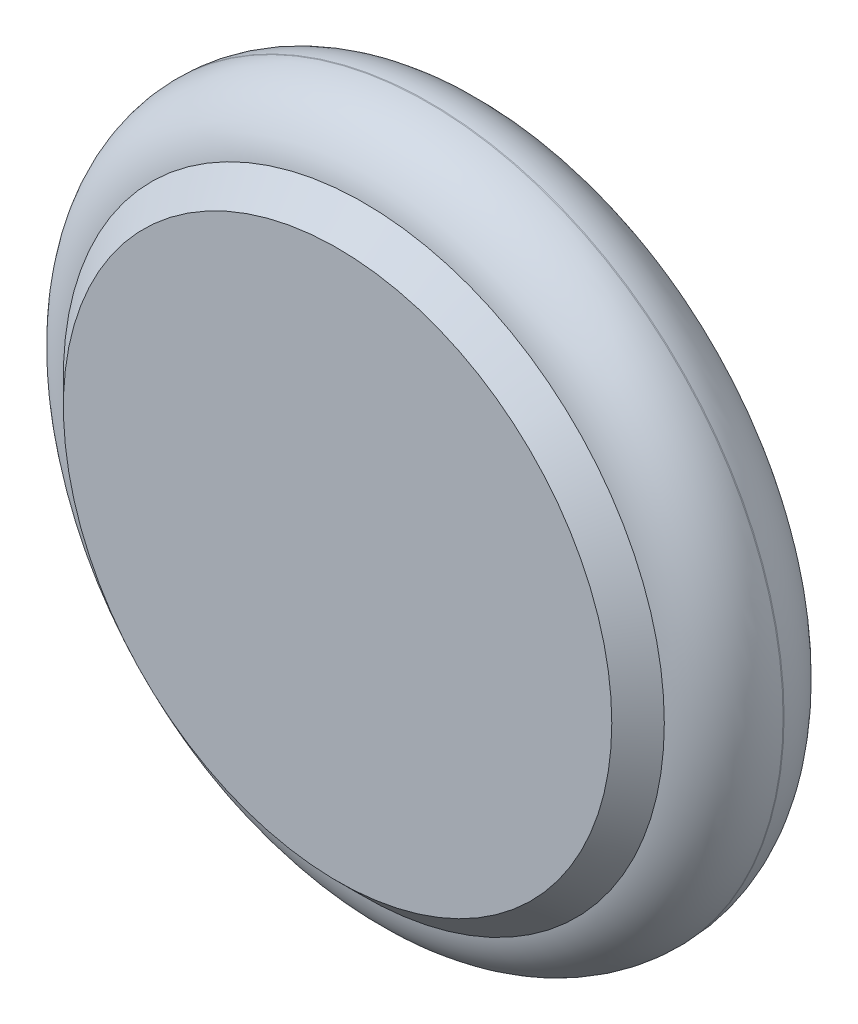
ISO-10303-21;
HEADER;
FILE_DESCRIPTION(('STEP AP214'),'2;1');
FILE_NAME('part.step','',(''),(''),'','','');
FILE_SCHEMA(('AUTOMOTIVE_DESIGN { 1 0 10303 214 1 1 1 1 }'));
ENDSEC;
DATA;
#1=APPLICATION_CONTEXT('core data for automotive mechanical design processes');
#2=APPLICATION_PROTOCOL_DEFINITION('international standard','automotive_design',2000,#1);
#3=PRODUCT_CONTEXT('',#1,'mechanical');
#4=PRODUCT('Part','Part','',(#3));
#5=PRODUCT_RELATED_PRODUCT_CATEGORY('part','',(#4));
#6=PRODUCT_DEFINITION_FORMATION('','',#4);
#7=PRODUCT_DEFINITION_CONTEXT('part definition',#1,'design');
#8=PRODUCT_DEFINITION('design','',#6,#7);
#9=PRODUCT_DEFINITION_SHAPE('','',#8);
#10=(LENGTH_UNIT() NAMED_UNIT(*) SI_UNIT(.MILLI.,.METRE.));
#11=(NAMED_UNIT(*) PLANE_ANGLE_UNIT() SI_UNIT($,.RADIAN.));
#12=(NAMED_UNIT(*) SI_UNIT($,.STERADIAN.) SOLID_ANGLE_UNIT());
#13=UNCERTAINTY_MEASURE_WITH_UNIT(LENGTH_MEASURE(1.E-05),#10,'distance_accuracy_value','');
#14=(GEOMETRIC_REPRESENTATION_CONTEXT(3) GLOBAL_UNCERTAINTY_ASSIGNED_CONTEXT((#13)) GLOBAL_UNIT_ASSIGNED_CONTEXT((#10,
#11,#12)) REPRESENTATION_CONTEXT('',''));
#15=CARTESIAN_POINT('',(0.,0.,0.));
#16=DIRECTION('',(0.,0.,1.));
#17=DIRECTION('',(1.,0.,0.));
#18=AXIS2_PLACEMENT_3D('',#15,#16,#17);
#19=CARTESIAN_POINT('',(0.,0.,40.));
#20=DIRECTION('',(0.,0.,-1.));
#21=DIRECTION('',(-1.,0.,0.));
#22=AXIS2_PLACEMENT_3D('',#19,#20,#21);
#23=CYLINDRICAL_SURFACE('',#22,108.);
#24=CARTESIAN_POINT('',(0.,0.,20.));
#25=DIRECTION('',(0.,0.,1.));
#26=DIRECTION('',(1.,0.,0.));
#27=AXIS2_PLACEMENT_3D('',#24,#25,#26);
#28=CIRCLE('',#27,108.);
#29=CARTESIAN_POINT('',(108.,0.,20.));
#30=VERTEX_POINT('',#29);
#31=EDGE_CURVE('E46',#30,#30,#28,.T.);
#32=ORIENTED_EDGE('',*,*,#31,.T.);
#33=EDGE_LOOP('',(#32));
#34=FACE_BOUND('',#33,.T.);
#35=CARTESIAN_POINT('',(0.,0.,20.311876093929));
#36=DIRECTION('',(0.,0.,1.));
#37=DIRECTION('',(1.,0.,0.));
#38=AXIS2_PLACEMENT_3D('',#35,#36,#37);
#39=CIRCLE('',#38,108.);
#40=CARTESIAN_POINT('',(108.,0.,20.311876093929));
#41=VERTEX_POINT('',#40);
#42=EDGE_CURVE('E51',#41,#41,#39,.F.);
#43=ORIENTED_EDGE('',*,*,#42,.T.);
#44=EDGE_LOOP('',(#43));
#45=FACE_BOUND('',#44,.T.);
#46=ADVANCED_FACE('F31',(#34,#45),#23,.T.);
#47=CARTESIAN_POINT('',(0.,0.,0.));
#48=DIRECTION('',(0.,0.,1.));
#49=DIRECTION('',(1.,0.,0.));
#50=AXIS2_PLACEMENT_3D('',#47,#48,#49);
#51=PLANE('',#50);
#52=CARTESIAN_POINT('',(0.,0.,0.));
#53=DIRECTION('',(0.,0.,1.));
#54=DIRECTION('',(1.,0.,0.));
#55=AXIS2_PLACEMENT_3D('',#52,#53,#54);
#56=CIRCLE('',#55,18.);
#57=CARTESIAN_POINT('',(18.,0.,0.));
#58=VERTEX_POINT('',#57);
#59=EDGE_CURVE('E10',#58,#58,#56,.T.);
#60=ORIENTED_EDGE('',*,*,#59,.T.);
#61=EDGE_LOOP('',(#60));
#62=FACE_BOUND('',#61,.T.);
#63=CARTESIAN_POINT('',(0.,0.,0.));
#64=DIRECTION('',(0.,0.,1.));
#65=DIRECTION('',(1.,0.,0.));
#66=AXIS2_PLACEMENT_3D('',#63,#64,#65);
#67=CIRCLE('',#66,88.);
#68=CARTESIAN_POINT('',(88.,0.,0.));
#69=VERTEX_POINT('',#68);
#70=EDGE_CURVE('E42',#69,#69,#67,.F.);
#71=ORIENTED_EDGE('',*,*,#70,.T.);
#72=EDGE_LOOP('',(#71));
#73=FACE_BOUND('',#72,.T.);
#74=ADVANCED_FACE('F78',(#62,#73),#51,.F.);
#75=CARTESIAN_POINT('',(0.,0.,48.));
#76=DIRECTION('',(0.,0.,1.));
#77=DIRECTION('',(1.,0.,0.));
#78=AXIS2_PLACEMENT_3D('',#75,#76,#77);
#79=PLANE('',#78);
#80=CARTESIAN_POINT('',(0.,0.,48.));
#81=DIRECTION('',(0.,0.,1.));
#82=DIRECTION('',(1.,0.,0.));
#83=AXIS2_PLACEMENT_3D('',#80,#81,#82);
#84=CIRCLE('',#83,83.5182065117322);
#85=CARTESIAN_POINT('',(83.5182065117322,0.,48.));
#86=VERTEX_POINT('',#85);
#87=EDGE_CURVE('E54',#86,#86,#84,.T.);
#88=ORIENTED_EDGE('',*,*,#87,.T.);
#89=EDGE_LOOP('',(#88));
#90=FACE_BOUND('',#89,.T.);
#91=ADVANCED_FACE('F84',(#90),#79,.T.);
#92=CARTESIAN_POINT('',(0.,0.,48.));
#93=DIRECTION('',(0.,0.,-1.));
#94=DIRECTION('',(-1.,0.,0.));
#95=AXIS2_PLACEMENT_3D('',#92,#93,#94);
#96=CONICAL_SURFACE('',#95,83.5182065117322,0.785398163397449);
#97=CARTESIAN_POINT('',(0.,0.,40.));
#98=DIRECTION('',(0.,0.,1.));
#99=DIRECTION('',(1.,0.,0.));
#100=AXIS2_PLACEMENT_3D('',#97,#98,#99);
#101=CIRCLE('',#100,91.5182065117323);
#102=CARTESIAN_POINT('',(91.5182065117323,0.,40.));
#103=VERTEX_POINT('',#102);
#104=EDGE_CURVE('E57',#103,#103,#101,.T.);
#105=ORIENTED_EDGE('',*,*,#104,.T.);
#106=EDGE_LOOP('',(#105));
#107=FACE_BOUND('',#106,.T.);
#108=ORIENTED_EDGE('',*,*,#87,.F.);
#109=EDGE_LOOP('',(#108));
#110=FACE_BOUND('',#109,.T.);
#111=ADVANCED_FACE('F61',(#107,#110),#96,.T.);
#112=CARTESIAN_POINT('',(0.,0.,20.));
#113=DIRECTION('',(0.,0.,1.));
#114=DIRECTION('',(1.,0.,0.));
#115=AXIS2_PLACEMENT_3D('',#112,#113,#114);
#116=TOROIDAL_SURFACE('',#115,88.,20.);
#117=ORIENTED_EDGE('',*,*,#70,.F.);
#118=EDGE_LOOP('',(#117));
#119=FACE_BOUND('',#118,.T.);
#120=ORIENTED_EDGE('',*,*,#31,.F.);
#121=EDGE_LOOP('',(#120));
#122=FACE_BOUND('',#121,.T.);
#123=ADVANCED_FACE('F67',(#119,#122),#116,.T.);
#124=CARTESIAN_POINT('',(0.,0.,20.311876093929));
#125=DIRECTION('',(0.,0.,1.));
#126=DIRECTION('',(1.,0.,0.));
#127=AXIS2_PLACEMENT_3D('',#124,#125,#126);
#128=TOROIDAL_SURFACE('',#127,88.,20.);
#129=ORIENTED_EDGE('',*,*,#42,.F.);
#130=EDGE_LOOP('',(#129));
#131=FACE_BOUND('',#130,.T.);
#132=ORIENTED_EDGE('',*,*,#104,.F.);
#133=EDGE_LOOP('',(#132));
#134=FACE_BOUND('',#133,.T.);
#135=ADVANCED_FACE('F64',(#131,#134),#128,.T.);
#136=CARTESIAN_POINT('',(0.,0.,-2.));
#137=DIRECTION('',(0.,0.,-1.));
#138=DIRECTION('',(-1.,0.,0.));
#139=AXIS2_PLACEMENT_3D('',#136,#137,#138);
#140=PLANE('',#139);
#141=CARTESIAN_POINT('',(0.,0.,-2.));
#142=DIRECTION('',(0.,0.,-1.));
#143=DIRECTION('',(-1.,0.,0.));
#144=AXIS2_PLACEMENT_3D('',#141,#142,#143);
#145=CIRCLE('',#144,15.9999999999999);
#146=CARTESIAN_POINT('',(-15.9999999999999,0.,-2.));
#147=VERTEX_POINT('',#146);
#148=EDGE_CURVE('E38',#147,#147,#145,.T.);
#149=ORIENTED_EDGE('',*,*,#148,.T.);
#150=EDGE_LOOP('',(#149));
#151=FACE_BOUND('',#150,.T.);
#152=ADVANCED_FACE('F66',(#151),#140,.T.);
#153=CARTESIAN_POINT('',(0.,0.,-2.));
#154=DIRECTION('',(0.,0.,1.));
#155=DIRECTION('',(1.,0.,0.));
#156=AXIS2_PLACEMENT_3D('',#153,#154,#155);
#157=CONICAL_SURFACE('',#156,15.9999999999999,0.785398163397453);
#158=ORIENTED_EDGE('',*,*,#59,.F.);
#159=EDGE_LOOP('',(#158));
#160=FACE_BOUND('',#159,.T.);
#161=ORIENTED_EDGE('',*,*,#148,.F.);
#162=EDGE_LOOP('',(#161));
#163=FACE_BOUND('',#162,.T.);
#164=ADVANCED_FACE('F33',(#160,#163),#157,.T.);
#165=CLOSED_SHELL('',(#46,#74,#91,#111,#123,#135,#152,#164));
#166=MANIFOLD_SOLID_BREP('B2',#165);
#167=ADVANCED_BREP_SHAPE_REPRESENTATION('',(#18,#166),#14);
#168=SHAPE_DEFINITION_REPRESENTATION(#9,#167);
ENDSEC;
END-ISO-10303-21;
